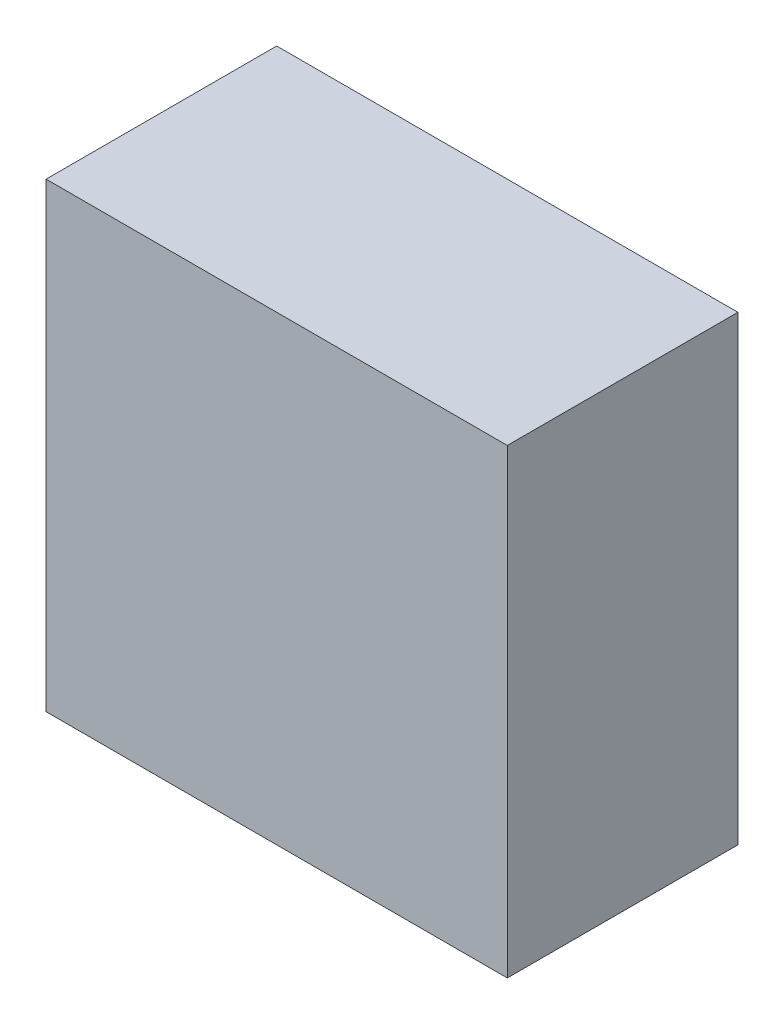
ISO-10303-21;
HEADER;
FILE_DESCRIPTION(('STEP AP214'),'2;1');
FILE_NAME('part.step','',(''),(''),'','','');
FILE_SCHEMA(('AUTOMOTIVE_DESIGN { 1 0 10303 214 1 1 1 1 }'));
ENDSEC;
DATA;
#1=APPLICATION_CONTEXT('core data for automotive mechanical design processes');
#2=APPLICATION_PROTOCOL_DEFINITION('international standard','automotive_design',2000,#1);
#3=PRODUCT_CONTEXT('',#1,'mechanical');
#4=PRODUCT('Part','Part','',(#3));
#5=PRODUCT_RELATED_PRODUCT_CATEGORY('part','',(#4));
#6=PRODUCT_DEFINITION_FORMATION('','',#4);
#7=PRODUCT_DEFINITION_CONTEXT('part definition',#1,'design');
#8=PRODUCT_DEFINITION('design','',#6,#7);
#9=PRODUCT_DEFINITION_SHAPE('','',#8);
#10=(LENGTH_UNIT() NAMED_UNIT(*) SI_UNIT(.MILLI.,.METRE.));
#11=(NAMED_UNIT(*) PLANE_ANGLE_UNIT() SI_UNIT($,.RADIAN.));
#12=(NAMED_UNIT(*) SI_UNIT($,.STERADIAN.) SOLID_ANGLE_UNIT());
#13=UNCERTAINTY_MEASURE_WITH_UNIT(LENGTH_MEASURE(1.E-05),#10,'distance_accuracy_value','');
#14=(GEOMETRIC_REPRESENTATION_CONTEXT(3) GLOBAL_UNCERTAINTY_ASSIGNED_CONTEXT((#13)) GLOBAL_UNIT_ASSIGNED_CONTEXT((#10,
#11,#12)) REPRESENTATION_CONTEXT('',''));
#15=CARTESIAN_POINT('',(0.,0.,0.));
#16=DIRECTION('',(0.,0.,1.));
#17=DIRECTION('',(1.,0.,0.));
#18=AXIS2_PLACEMENT_3D('',#15,#16,#17);
#19=CARTESIAN_POINT('',(10.,-10.,10.));
#20=DIRECTION('',(-1.,0.,0.));
#21=DIRECTION('',(0.,0.,1.));
#22=AXIS2_PLACEMENT_3D('',#19,#20,#21);
#23=PLANE('',#22);
#24=DIRECTION('',(0.,1.,0.));
#25=VECTOR('',#24,1.);
#26=CARTESIAN_POINT('',(10.,-10.,0.));
#27=LINE('',#26,#25);
#28=CARTESIAN_POINT('',(10.,-10.,0.));
#29=VERTEX_POINT('',#28);
#30=CARTESIAN_POINT('',(10.,10.,0.));
#31=VERTEX_POINT('',#30);
#32=EDGE_CURVE('E301',#29,#31,#27,.T.);
#33=ORIENTED_EDGE('',*,*,#32,.T.);
#34=DIRECTION('',(0.,0.,-1.));
#35=VECTOR('',#34,1.);
#36=CARTESIAN_POINT('',(10.,10.,10.));
#37=LINE('',#36,#35);
#38=CARTESIAN_POINT('',(10.,10.,10.));
#39=VERTEX_POINT('',#38);
#40=EDGE_CURVE('E42',#39,#31,#37,.T.);
#41=ORIENTED_EDGE('',*,*,#40,.F.);
#42=DIRECTION('',(0.,1.,0.));
#43=VECTOR('',#42,1.);
#44=CARTESIAN_POINT('',(10.,-10.,10.));
#45=LINE('',#44,#43);
#46=CARTESIAN_POINT('',(10.,-10.,10.));
#47=VERTEX_POINT('',#46);
#48=EDGE_CURVE('E307',#47,#39,#45,.T.);
#49=ORIENTED_EDGE('',*,*,#48,.F.);
#50=DIRECTION('',(0.,0.,-1.));
#51=VECTOR('',#50,1.);
#52=CARTESIAN_POINT('',(10.,-10.,10.));
#53=LINE('',#52,#51);
#54=EDGE_CURVE('E317',#47,#29,#53,.T.);
#55=ORIENTED_EDGE('',*,*,#54,.T.);
#56=EDGE_LOOP('',(#33,#41,#49,#55));
#57=FACE_BOUND('',#56,.T.);
#58=ADVANCED_FACE('F35',(#57),#23,.F.);
#59=CARTESIAN_POINT('',(-10.,10.,10.));
#60=DIRECTION('',(0.,-1.,0.));
#61=DIRECTION('',(0.,0.,-1.));
#62=AXIS2_PLACEMENT_3D('',#59,#60,#61);
#63=PLANE('',#62);
#64=DIRECTION('',(-1.,0.,0.));
#65=VECTOR('',#64,1.);
#66=CARTESIAN_POINT('',(-10.,10.,0.));
#67=LINE('',#66,#65);
#68=CARTESIAN_POINT('',(-10.,10.,0.));
#69=VERTEX_POINT('',#68);
#70=EDGE_CURVE('E320',#31,#69,#67,.T.);
#71=ORIENTED_EDGE('',*,*,#70,.T.);
#72=DIRECTION('',(0.,0.,-1.));
#73=VECTOR('',#72,1.);
#74=CARTESIAN_POINT('',(-10.,10.,10.));
#75=LINE('',#74,#73);
#76=CARTESIAN_POINT('',(-10.,10.,10.));
#77=VERTEX_POINT('',#76);
#78=EDGE_CURVE('E330',#77,#69,#75,.T.);
#79=ORIENTED_EDGE('',*,*,#78,.F.);
#80=DIRECTION('',(-1.,0.,0.));
#81=VECTOR('',#80,1.);
#82=CARTESIAN_POINT('',(-10.,10.,10.));
#83=LINE('',#82,#81);
#84=EDGE_CURVE('E310',#39,#77,#83,.T.);
#85=ORIENTED_EDGE('',*,*,#84,.F.);
#86=ORIENTED_EDGE('',*,*,#40,.T.);
#87=EDGE_LOOP('',(#71,#79,#85,#86));
#88=FACE_BOUND('',#87,.T.);
#89=ADVANCED_FACE('F335',(#88),#63,.F.);
#90=CARTESIAN_POINT('',(-10.,-10.,10.));
#91=DIRECTION('',(1.,0.,0.));
#92=DIRECTION('',(0.,0.,-1.));
#93=AXIS2_PLACEMENT_3D('',#90,#91,#92);
#94=PLANE('',#93);
#95=DIRECTION('',(0.,-1.,0.));
#96=VECTOR('',#95,1.);
#97=CARTESIAN_POINT('',(-10.,-10.,0.));
#98=LINE('',#97,#96);
#99=CARTESIAN_POINT('',(-10.,-10.,0.));
#100=VERTEX_POINT('',#99);
#101=EDGE_CURVE('E322',#69,#100,#98,.T.);
#102=ORIENTED_EDGE('',*,*,#101,.T.);
#103=DIRECTION('',(0.,0.,-1.));
#104=VECTOR('',#103,1.);
#105=CARTESIAN_POINT('',(-10.,-10.,10.));
#106=LINE('',#105,#104);
#107=CARTESIAN_POINT('',(-10.,-10.,10.));
#108=VERTEX_POINT('',#107);
#109=EDGE_CURVE('E327',#108,#100,#106,.T.);
#110=ORIENTED_EDGE('',*,*,#109,.F.);
#111=DIRECTION('',(0.,-1.,0.));
#112=VECTOR('',#111,1.);
#113=CARTESIAN_POINT('',(-10.,-10.,10.));
#114=LINE('',#113,#112);
#115=EDGE_CURVE('E313',#77,#108,#114,.T.);
#116=ORIENTED_EDGE('',*,*,#115,.F.);
#117=ORIENTED_EDGE('',*,*,#78,.T.);
#118=EDGE_LOOP('',(#102,#110,#116,#117));
#119=FACE_BOUND('',#118,.T.);
#120=ADVANCED_FACE('F347',(#119),#94,.F.);
#121=CARTESIAN_POINT('',(-10.,-10.,10.));
#122=DIRECTION('',(0.,1.,0.));
#123=DIRECTION('',(0.,0.,1.));
#124=AXIS2_PLACEMENT_3D('',#121,#122,#123);
#125=PLANE('',#124);
#126=DIRECTION('',(1.,0.,0.));
#127=VECTOR('',#126,1.);
#128=CARTESIAN_POINT('',(-10.,-10.,0.));
#129=LINE('',#128,#127);
#130=EDGE_CURVE('E311',#100,#29,#129,.T.);
#131=ORIENTED_EDGE('',*,*,#130,.T.);
#132=ORIENTED_EDGE('',*,*,#54,.F.);
#133=DIRECTION('',(1.,0.,0.));
#134=VECTOR('',#133,1.);
#135=CARTESIAN_POINT('',(-10.,-10.,10.));
#136=LINE('',#135,#134);
#137=EDGE_CURVE('E315',#108,#47,#136,.T.);
#138=ORIENTED_EDGE('',*,*,#137,.F.);
#139=ORIENTED_EDGE('',*,*,#109,.T.);
#140=EDGE_LOOP('',(#131,#132,#138,#139));
#141=FACE_BOUND('',#140,.T.);
#142=ADVANCED_FACE('F351',(#141),#125,.F.);
#143=CARTESIAN_POINT('',(0.,0.,10.));
#144=DIRECTION('',(0.,0.,-1.));
#145=DIRECTION('',(-1.,0.,0.));
#146=AXIS2_PLACEMENT_3D('',#143,#144,#145);
#147=PLANE('',#146);
#148=ORIENTED_EDGE('',*,*,#48,.T.);
#149=ORIENTED_EDGE('',*,*,#84,.T.);
#150=ORIENTED_EDGE('',*,*,#115,.T.);
#151=ORIENTED_EDGE('',*,*,#137,.T.);
#152=EDGE_LOOP('',(#148,#149,#150,#151));
#153=FACE_BOUND('',#152,.T.);
#154=ADVANCED_FACE('F353',(#153),#147,.F.);
#155=CARTESIAN_POINT('',(0.,0.,0.));
#156=DIRECTION('',(0.,0.,-1.));
#157=DIRECTION('',(-1.,0.,0.));
#158=AXIS2_PLACEMENT_3D('',#155,#156,#157);
#159=PLANE('',#158);
#160=DIRECTION('',(0.,1.,0.));
#161=VECTOR('',#160,1.);
#162=CARTESIAN_POINT('',(-8.5,-8.5,0.));
#163=LINE('',#162,#161);
#164=CARTESIAN_POINT('',(-8.5,-8.5,0.));
#165=VERTEX_POINT('',#164);
#166=CARTESIAN_POINT('',(-8.5,8.5,0.));
#167=VERTEX_POINT('',#166);
#168=EDGE_CURVE('E57',#165,#167,#163,.T.);
#169=ORIENTED_EDGE('',*,*,#168,.F.);
#170=DIRECTION('',(-1.,0.,0.));
#171=VECTOR('',#170,1.);
#172=CARTESIAN_POINT('',(8.5,-8.5,0.));
#173=LINE('',#172,#171);
#174=CARTESIAN_POINT('',(8.5,-8.5,0.));
#175=VERTEX_POINT('',#174);
#176=EDGE_CURVE('E280',#175,#165,#173,.T.);
#177=ORIENTED_EDGE('',*,*,#176,.F.);
#178=DIRECTION('',(0.,-1.,0.));
#179=VECTOR('',#178,1.);
#180=CARTESIAN_POINT('',(8.5,-8.5,0.));
#181=LINE('',#180,#179);
#182=CARTESIAN_POINT('',(8.5,8.5,0.));
#183=VERTEX_POINT('',#182);
#184=EDGE_CURVE('E294',#183,#175,#181,.T.);
#185=ORIENTED_EDGE('',*,*,#184,.F.);
#186=DIRECTION('',(1.,0.,0.));
#187=VECTOR('',#186,1.);
#188=CARTESIAN_POINT('',(8.5,8.5,0.));
#189=LINE('',#188,#187);
#190=EDGE_CURVE('E291',#167,#183,#189,.T.);
#191=ORIENTED_EDGE('',*,*,#190,.F.);
#192=EDGE_LOOP('',(#169,#177,#185,#191));
#193=FACE_BOUND('',#192,.T.);
#194=ORIENTED_EDGE('',*,*,#32,.F.);
#195=ORIENTED_EDGE('',*,*,#130,.F.);
#196=ORIENTED_EDGE('',*,*,#101,.F.);
#197=ORIENTED_EDGE('',*,*,#70,.F.);
#198=EDGE_LOOP('',(#194,#195,#196,#197));
#199=FACE_BOUND('',#198,.T.);
#200=ADVANCED_FACE('F343',(#193,#199),#159,.T.);
#201=CARTESIAN_POINT('',(-8.5,-8.5,7.5));
#202=DIRECTION('',(-1.,0.,0.));
#203=DIRECTION('',(0.,0.,1.));
#204=AXIS2_PLACEMENT_3D('',#201,#202,#203);
#205=PLANE('',#204);
#206=ORIENTED_EDGE('',*,*,#168,.T.);
#207=DIRECTION('',(0.,0.,-1.));
#208=VECTOR('',#207,1.);
#209=CARTESIAN_POINT('',(-8.5,8.5,7.5));
#210=LINE('',#209,#208);
#211=CARTESIAN_POINT('',(-8.5,8.5,7.5));
#212=VERTEX_POINT('',#211);
#213=EDGE_CURVE('E289',#212,#167,#210,.T.);
#214=ORIENTED_EDGE('',*,*,#213,.F.);
#215=DIRECTION('',(0.,1.,0.));
#216=VECTOR('',#215,1.);
#217=CARTESIAN_POINT('',(-8.5,-8.5,7.5));
#218=LINE('',#217,#216);
#219=CARTESIAN_POINT('',(-8.5,-8.5,7.5));
#220=VERTEX_POINT('',#219);
#221=EDGE_CURVE('E276',#220,#212,#218,.T.);
#222=ORIENTED_EDGE('',*,*,#221,.F.);
#223=DIRECTION('',(0.,0.,-1.));
#224=VECTOR('',#223,1.);
#225=CARTESIAN_POINT('',(-8.5,-8.5,7.5));
#226=LINE('',#225,#224);
#227=EDGE_CURVE('E299',#220,#165,#226,.T.);
#228=ORIENTED_EDGE('',*,*,#227,.T.);
#229=EDGE_LOOP('',(#206,#214,#222,#228));
#230=FACE_BOUND('',#229,.T.);
#231=ADVANCED_FACE('F360',(#230),#205,.F.);
#232=CARTESIAN_POINT('',(8.5,-8.5,7.5));
#233=DIRECTION('',(0.,-1.,0.));
#234=DIRECTION('',(0.,0.,-1.));
#235=AXIS2_PLACEMENT_3D('',#232,#233,#234);
#236=PLANE('',#235);
#237=ORIENTED_EDGE('',*,*,#176,.T.);
#238=ORIENTED_EDGE('',*,*,#227,.F.);
#239=DIRECTION('',(-1.,0.,0.));
#240=VECTOR('',#239,1.);
#241=CARTESIAN_POINT('',(8.5,-8.5,7.5));
#242=LINE('',#241,#240);
#243=CARTESIAN_POINT('',(8.5,-8.5,7.5));
#244=VERTEX_POINT('',#243);
#245=EDGE_CURVE('E286',#244,#220,#242,.T.);
#246=ORIENTED_EDGE('',*,*,#245,.F.);
#247=DIRECTION('',(0.,0.,-1.));
#248=VECTOR('',#247,1.);
#249=CARTESIAN_POINT('',(8.5,-8.5,7.5));
#250=LINE('',#249,#248);
#251=EDGE_CURVE('E302',#244,#175,#250,.T.);
#252=ORIENTED_EDGE('',*,*,#251,.T.);
#253=EDGE_LOOP('',(#237,#238,#246,#252));
#254=FACE_BOUND('',#253,.T.);
#255=ADVANCED_FACE('F398',(#254),#236,.F.);
#256=CARTESIAN_POINT('',(8.5,-8.5,7.5));
#257=DIRECTION('',(1.,0.,0.));
#258=DIRECTION('',(0.,0.,-1.));
#259=AXIS2_PLACEMENT_3D('',#256,#257,#258);
#260=PLANE('',#259);
#261=ORIENTED_EDGE('',*,*,#184,.T.);
#262=ORIENTED_EDGE('',*,*,#251,.F.);
#263=DIRECTION('',(0.,-1.,0.));
#264=VECTOR('',#263,1.);
#265=CARTESIAN_POINT('',(8.5,-8.5,7.5));
#266=LINE('',#265,#264);
#267=CARTESIAN_POINT('',(8.5,8.5,7.5));
#268=VERTEX_POINT('',#267);
#269=EDGE_CURVE('E283',#268,#244,#266,.T.);
#270=ORIENTED_EDGE('',*,*,#269,.F.);
#271=DIRECTION('',(0.,0.,-1.));
#272=VECTOR('',#271,1.);
#273=CARTESIAN_POINT('',(8.5,8.5,7.5));
#274=LINE('',#273,#272);
#275=EDGE_CURVE('E304',#268,#183,#274,.T.);
#276=ORIENTED_EDGE('',*,*,#275,.T.);
#277=EDGE_LOOP('',(#261,#262,#270,#276));
#278=FACE_BOUND('',#277,.T.);
#279=ADVANCED_FACE('F406',(#278),#260,.F.);
#280=CARTESIAN_POINT('',(8.5,8.5,7.5));
#281=DIRECTION('',(0.,1.,0.));
#282=DIRECTION('',(0.,0.,1.));
#283=AXIS2_PLACEMENT_3D('',#280,#281,#282);
#284=PLANE('',#283);
#285=ORIENTED_EDGE('',*,*,#190,.T.);
#286=ORIENTED_EDGE('',*,*,#275,.F.);
#287=DIRECTION('',(1.,0.,0.));
#288=VECTOR('',#287,1.);
#289=CARTESIAN_POINT('',(8.5,8.5,7.5));
#290=LINE('',#289,#288);
#291=EDGE_CURVE('E279',#212,#268,#290,.T.);
#292=ORIENTED_EDGE('',*,*,#291,.F.);
#293=ORIENTED_EDGE('',*,*,#213,.T.);
#294=EDGE_LOOP('',(#285,#286,#292,#293));
#295=FACE_BOUND('',#294,.T.);
#296=ADVANCED_FACE('F416',(#295),#284,.F.);
#297=CARTESIAN_POINT('',(0.,0.,7.5));
#298=DIRECTION('',(0.,0.,1.));
#299=DIRECTION('',(1.,0.,0.));
#300=AXIS2_PLACEMENT_3D('',#297,#298,#299);
#301=PLANE('',#300);
#302=CARTESIAN_POINT('',(0.,0.,7.5));
#303=DIRECTION('',(0.,0.,1.));
#304=DIRECTION('',(1.,0.,0.));
#305=AXIS2_PLACEMENT_3D('',#302,#303,#304);
#306=CIRCLE('',#305,2.65);
#307=CARTESIAN_POINT('',(2.65,0.,7.5));
#308=VERTEX_POINT('',#307);
#309=EDGE_CURVE('E11',#308,#308,#306,.F.);
#310=ORIENTED_EDGE('',*,*,#309,.F.);
#311=EDGE_LOOP('',(#310));
#312=FACE_BOUND('',#311,.T.);
#313=ORIENTED_EDGE('',*,*,#221,.T.);
#314=ORIENTED_EDGE('',*,*,#291,.T.);
#315=ORIENTED_EDGE('',*,*,#269,.T.);
#316=ORIENTED_EDGE('',*,*,#245,.T.);
#317=EDGE_LOOP('',(#313,#314,#315,#316));
#318=FACE_BOUND('',#317,.T.);
#319=ADVANCED_FACE('F426',(#312,#318),#301,.F.);
#320=CARTESIAN_POINT('',(0.,0.,0.));
#321=DIRECTION('',(0.,0.,1.));
#322=DIRECTION('',(1.,0.,0.));
#323=AXIS2_PLACEMENT_3D('',#320,#321,#322);
#324=CYLINDRICAL_SURFACE('',#323,2.65);
#325=CARTESIAN_POINT('',(0.,0.,0.));
#326=DIRECTION('',(0.,0.,-1.));
#327=DIRECTION('',(-1.,0.,0.));
#328=AXIS2_PLACEMENT_3D('',#325,#326,#327);
#329=CIRCLE('',#328,2.65);
#330=CARTESIAN_POINT('',(-2.65,0.,0.));
#331=VERTEX_POINT('',#330);
#332=EDGE_CURVE('E254',#331,#331,#329,.T.);
#333=ORIENTED_EDGE('',*,*,#332,.F.);
#334=EDGE_LOOP('',(#333));
#335=FACE_BOUND('',#334,.T.);
#336=ORIENTED_EDGE('',*,*,#309,.T.);
#337=EDGE_LOOP('',(#336));
#338=FACE_BOUND('',#337,.T.);
#339=ADVANCED_FACE('F436',(#335,#338),#324,.T.);
#340=CARTESIAN_POINT('',(0.,0.,0.));
#341=DIRECTION('',(0.,0.,-1.));
#342=DIRECTION('',(-1.,0.,0.));
#343=AXIS2_PLACEMENT_3D('',#340,#341,#342);
#344=PLANE('',#343);
#345=DIRECTION('',(-1.,0.,0.));
#346=VECTOR('',#345,1.);
#347=CARTESIAN_POINT('',(-0.7,-0.7,0.));
#348=LINE('',#347,#346);
#349=CARTESIAN_POINT('',(-0.7,-0.7,0.));
#350=VERTEX_POINT('',#349);
#351=CARTESIAN_POINT('',(-2.15,-0.7,0.));
#352=VERTEX_POINT('',#351);
#353=EDGE_CURVE('E49',#350,#352,#348,.T.);
#354=ORIENTED_EDGE('',*,*,#353,.F.);
#355=DIRECTION('',(0.,1.,0.));
#356=VECTOR('',#355,1.);
#357=CARTESIAN_POINT('',(-0.7,-2.15,0.));
#358=LINE('',#357,#356);
#359=CARTESIAN_POINT('',(-0.7,-2.15,0.));
#360=VERTEX_POINT('',#359);
#361=EDGE_CURVE('E192',#360,#350,#358,.T.);
#362=ORIENTED_EDGE('',*,*,#361,.F.);
#363=DIRECTION('',(-1.,0.,0.));
#364=VECTOR('',#363,1.);
#365=CARTESIAN_POINT('',(0.7,-2.15,0.));
#366=LINE('',#365,#364);
#367=CARTESIAN_POINT('',(0.7,-2.15,0.));
#368=VERTEX_POINT('',#367);
#369=EDGE_CURVE('E195',#368,#360,#366,.T.);
#370=ORIENTED_EDGE('',*,*,#369,.F.);
#371=DIRECTION('',(0.,-1.,0.));
#372=VECTOR('',#371,1.);
#373=CARTESIAN_POINT('',(0.7,-2.15,0.));
#374=LINE('',#373,#372);
#375=CARTESIAN_POINT('',(0.7,-0.7,0.));
#376=VERTEX_POINT('',#375);
#377=EDGE_CURVE('E247',#376,#368,#374,.T.);
#378=ORIENTED_EDGE('',*,*,#377,.F.);
#379=DIRECTION('',(-1.,0.,0.));
#380=VECTOR('',#379,1.);
#381=CARTESIAN_POINT('',(0.7,-0.7,0.));
#382=LINE('',#381,#380);
#383=CARTESIAN_POINT('',(2.15,-0.7,0.));
#384=VERTEX_POINT('',#383);
#385=EDGE_CURVE('E244',#384,#376,#382,.T.);
#386=ORIENTED_EDGE('',*,*,#385,.F.);
#387=DIRECTION('',(0.,-1.,0.));
#388=VECTOR('',#387,1.);
#389=CARTESIAN_POINT('',(2.15,0.7,0.));
#390=LINE('',#389,#388);
#391=CARTESIAN_POINT('',(2.15,0.7,0.));
#392=VERTEX_POINT('',#391);
#393=EDGE_CURVE('E241',#392,#384,#390,.T.);
#394=ORIENTED_EDGE('',*,*,#393,.F.);
#395=DIRECTION('',(1.,0.,0.));
#396=VECTOR('',#395,1.);
#397=CARTESIAN_POINT('',(0.7,0.7,0.));
#398=LINE('',#397,#396);
#399=CARTESIAN_POINT('',(0.7,0.7,0.));
#400=VERTEX_POINT('',#399);
#401=EDGE_CURVE('E238',#400,#392,#398,.T.);
#402=ORIENTED_EDGE('',*,*,#401,.F.);
#403=DIRECTION('',(0.,-1.,0.));
#404=VECTOR('',#403,1.);
#405=CARTESIAN_POINT('',(0.7,2.15,0.));
#406=LINE('',#405,#404);
#407=CARTESIAN_POINT('',(0.7,2.15,0.));
#408=VERTEX_POINT('',#407);
#409=EDGE_CURVE('E235',#408,#400,#406,.T.);
#410=ORIENTED_EDGE('',*,*,#409,.F.);
#411=DIRECTION('',(1.,0.,0.));
#412=VECTOR('',#411,1.);
#413=CARTESIAN_POINT('',(0.7,2.15,0.));
#414=LINE('',#413,#412);
#415=CARTESIAN_POINT('',(-0.7,2.15,0.));
#416=VERTEX_POINT('',#415);
#417=EDGE_CURVE('E232',#416,#408,#414,.T.);
#418=ORIENTED_EDGE('',*,*,#417,.F.);
#419=DIRECTION('',(0.,1.,0.));
#420=VECTOR('',#419,1.);
#421=CARTESIAN_POINT('',(-0.7,2.15,0.));
#422=LINE('',#421,#420);
#423=CARTESIAN_POINT('',(-0.7,0.7,0.));
#424=VERTEX_POINT('',#423);
#425=EDGE_CURVE('E229',#424,#416,#422,.T.);
#426=ORIENTED_EDGE('',*,*,#425,.F.);
#427=DIRECTION('',(1.,0.,0.));
#428=VECTOR('',#427,1.);
#429=CARTESIAN_POINT('',(-0.7,0.7,0.));
#430=LINE('',#429,#428);
#431=CARTESIAN_POINT('',(-2.15,0.7,0.));
#432=VERTEX_POINT('',#431);
#433=EDGE_CURVE('E226',#432,#424,#430,.T.);
#434=ORIENTED_EDGE('',*,*,#433,.F.);
#435=DIRECTION('',(0.,1.,0.));
#436=VECTOR('',#435,1.);
#437=CARTESIAN_POINT('',(-2.15,0.7,0.));
#438=LINE('',#437,#436);
#439=EDGE_CURVE('E224',#352,#432,#438,.T.);
#440=ORIENTED_EDGE('',*,*,#439,.F.);
#441=EDGE_LOOP('',(#354,#362,#370,#378,#386,#394,#402,#410,#418,#426,#434,#440));
#442=FACE_BOUND('',#441,.T.);
#443=ORIENTED_EDGE('',*,*,#332,.T.);
#444=EDGE_LOOP('',(#443));
#445=FACE_BOUND('',#444,.T.);
#446=ADVANCED_FACE('F446',(#442,#445),#344,.T.);
#447=CARTESIAN_POINT('',(-0.7,-0.7,7.5));
#448=DIRECTION('',(0.,-1.,0.));
#449=DIRECTION('',(0.,0.,-1.));
#450=AXIS2_PLACEMENT_3D('',#447,#448,#449);
#451=PLANE('',#450);
#452=ORIENTED_EDGE('',*,*,#353,.T.);
#453=DIRECTION('',(0.,0.,-1.));
#454=VECTOR('',#453,1.);
#455=CARTESIAN_POINT('',(-2.15,-0.7,7.5));
#456=LINE('',#455,#454);
#457=CARTESIAN_POINT('',(-2.15,-0.7,7.5));
#458=VERTEX_POINT('',#457);
#459=EDGE_CURVE('E169',#458,#352,#456,.T.);
#460=ORIENTED_EDGE('',*,*,#459,.F.);
#461=DIRECTION('',(-1.,0.,0.));
#462=VECTOR('',#461,1.);
#463=CARTESIAN_POINT('',(-0.7,-0.7,7.5));
#464=LINE('',#463,#462);
#465=CARTESIAN_POINT('',(-0.7,-0.7,7.5));
#466=VERTEX_POINT('',#465);
#467=EDGE_CURVE('E173',#466,#458,#464,.T.);
#468=ORIENTED_EDGE('',*,*,#467,.F.);
#469=DIRECTION('',(0.,0.,-1.));
#470=VECTOR('',#469,1.);
#471=CARTESIAN_POINT('',(-0.7,-0.7,7.5));
#472=LINE('',#471,#470);
#473=EDGE_CURVE('E252',#466,#350,#472,.T.);
#474=ORIENTED_EDGE('',*,*,#473,.T.);
#475=EDGE_LOOP('',(#452,#460,#468,#474));
#476=FACE_BOUND('',#475,.T.);
#477=ADVANCED_FACE('F171',(#476),#451,.F.);
#478=CARTESIAN_POINT('',(-0.7,-2.15,7.5));
#479=DIRECTION('',(-1.,0.,0.));
#480=DIRECTION('',(0.,-1.,0.));
#481=AXIS2_PLACEMENT_3D('',#478,#479,#480);
#482=PLANE('',#481);
#483=ORIENTED_EDGE('',*,*,#361,.T.);
#484=ORIENTED_EDGE('',*,*,#473,.F.);
#485=DIRECTION('',(0.,1.,0.));
#486=VECTOR('',#485,1.);
#487=CARTESIAN_POINT('',(-0.7,-2.15,7.5));
#488=LINE('',#487,#486);
#489=CARTESIAN_POINT('',(-0.7,-2.15,7.5));
#490=VERTEX_POINT('',#489);
#491=EDGE_CURVE('E179',#490,#466,#488,.T.);
#492=ORIENTED_EDGE('',*,*,#491,.F.);
#493=DIRECTION('',(0.,0.,-1.));
#494=VECTOR('',#493,1.);
#495=CARTESIAN_POINT('',(-0.7,-2.15,7.5));
#496=LINE('',#495,#494);
#497=EDGE_CURVE('E255',#490,#360,#496,.T.);
#498=ORIENTED_EDGE('',*,*,#497,.T.);
#499=EDGE_LOOP('',(#483,#484,#492,#498));
#500=FACE_BOUND('',#499,.T.);
#501=ADVANCED_FACE('F465',(#500),#482,.F.);
#502=CARTESIAN_POINT('',(0.7,-2.15,7.5));
#503=DIRECTION('',(0.,-1.,0.));
#504=DIRECTION('',(0.,0.,-1.));
#505=AXIS2_PLACEMENT_3D('',#502,#503,#504);
#506=PLANE('',#505);
#507=ORIENTED_EDGE('',*,*,#369,.T.);
#508=ORIENTED_EDGE('',*,*,#497,.F.);
#509=DIRECTION('',(-1.,0.,0.));
#510=VECTOR('',#509,1.);
#511=CARTESIAN_POINT('',(0.7,-2.15,7.5));
#512=LINE('',#511,#510);
#513=CARTESIAN_POINT('',(0.7,-2.15,7.5));
#514=VERTEX_POINT('',#513);
#515=EDGE_CURVE('E220',#514,#490,#512,.T.);
#516=ORIENTED_EDGE('',*,*,#515,.F.);
#517=DIRECTION('',(0.,0.,-1.));
#518=VECTOR('',#517,1.);
#519=CARTESIAN_POINT('',(0.7,-2.15,7.5));
#520=LINE('',#519,#518);
#521=EDGE_CURVE('E257',#514,#368,#520,.T.);
#522=ORIENTED_EDGE('',*,*,#521,.T.);
#523=EDGE_LOOP('',(#507,#508,#516,#522));
#524=FACE_BOUND('',#523,.T.);
#525=ADVANCED_FACE('F474',(#524),#506,.F.);
#526=CARTESIAN_POINT('',(0.7,-2.15,7.5));
#527=DIRECTION('',(1.,0.,0.));
#528=DIRECTION('',(0.,1.,0.));
#529=AXIS2_PLACEMENT_3D('',#526,#527,#528);
#530=PLANE('',#529);
#531=ORIENTED_EDGE('',*,*,#377,.T.);
#532=ORIENTED_EDGE('',*,*,#521,.F.);
#533=DIRECTION('',(0.,-1.,0.));
#534=VECTOR('',#533,1.);
#535=CARTESIAN_POINT('',(0.7,-2.15,7.5));
#536=LINE('',#535,#534);
#537=CARTESIAN_POINT('',(0.7,-0.7,7.5));
#538=VERTEX_POINT('',#537);
#539=EDGE_CURVE('E217',#538,#514,#536,.T.);
#540=ORIENTED_EDGE('',*,*,#539,.F.);
#541=DIRECTION('',(0.,0.,-1.));
#542=VECTOR('',#541,1.);
#543=CARTESIAN_POINT('',(0.7,-0.7,7.5));
#544=LINE('',#543,#542);
#545=EDGE_CURVE('E259',#538,#376,#544,.T.);
#546=ORIENTED_EDGE('',*,*,#545,.T.);
#547=EDGE_LOOP('',(#531,#532,#540,#546));
#548=FACE_BOUND('',#547,.T.);
#549=ADVANCED_FACE('F484',(#548),#530,.F.);
#550=CARTESIAN_POINT('',(0.7,-0.7,7.5));
#551=DIRECTION('',(0.,-1.,0.));
#552=DIRECTION('',(0.,0.,-1.));
#553=AXIS2_PLACEMENT_3D('',#550,#551,#552);
#554=PLANE('',#553);
#555=ORIENTED_EDGE('',*,*,#385,.T.);
#556=ORIENTED_EDGE('',*,*,#545,.F.);
#557=DIRECTION('',(-1.,0.,0.));
#558=VECTOR('',#557,1.);
#559=CARTESIAN_POINT('',(0.7,-0.7,7.5));
#560=LINE('',#559,#558);
#561=CARTESIAN_POINT('',(2.15,-0.7,7.5));
#562=VERTEX_POINT('',#561);
#563=EDGE_CURVE('E214',#562,#538,#560,.T.);
#564=ORIENTED_EDGE('',*,*,#563,.F.);
#565=DIRECTION('',(0.,0.,-1.));
#566=VECTOR('',#565,1.);
#567=CARTESIAN_POINT('',(2.15,-0.7,7.5));
#568=LINE('',#567,#566);
#569=EDGE_CURVE('E261',#562,#384,#568,.T.);
#570=ORIENTED_EDGE('',*,*,#569,.T.);
#571=EDGE_LOOP('',(#555,#556,#564,#570));
#572=FACE_BOUND('',#571,.T.);
#573=ADVANCED_FACE('F494',(#572),#554,.F.);
#574=CARTESIAN_POINT('',(2.15,0.7,7.5));
#575=DIRECTION('',(1.,0.,0.));
#576=DIRECTION('',(0.,0.,-1.));
#577=AXIS2_PLACEMENT_3D('',#574,#575,#576);
#578=PLANE('',#577);
#579=ORIENTED_EDGE('',*,*,#393,.T.);
#580=ORIENTED_EDGE('',*,*,#569,.F.);
#581=DIRECTION('',(0.,-1.,0.));
#582=VECTOR('',#581,1.);
#583=CARTESIAN_POINT('',(2.15,0.7,7.5));
#584=LINE('',#583,#582);
#585=CARTESIAN_POINT('',(2.15,0.7,7.5));
#586=VERTEX_POINT('',#585);
#587=EDGE_CURVE('E211',#586,#562,#584,.T.);
#588=ORIENTED_EDGE('',*,*,#587,.F.);
#589=DIRECTION('',(0.,0.,-1.));
#590=VECTOR('',#589,1.);
#591=CARTESIAN_POINT('',(2.15,0.7,7.5));
#592=LINE('',#591,#590);
#593=EDGE_CURVE('E263',#586,#392,#592,.T.);
#594=ORIENTED_EDGE('',*,*,#593,.T.);
#595=EDGE_LOOP('',(#579,#580,#588,#594));
#596=FACE_BOUND('',#595,.T.);
#597=ADVANCED_FACE('F504',(#596),#578,.F.);
#598=CARTESIAN_POINT('',(0.7,0.7,7.5));
#599=DIRECTION('',(0.,1.,0.));
#600=DIRECTION('',(0.,0.,1.));
#601=AXIS2_PLACEMENT_3D('',#598,#599,#600);
#602=PLANE('',#601);
#603=ORIENTED_EDGE('',*,*,#401,.T.);
#604=ORIENTED_EDGE('',*,*,#593,.F.);
#605=DIRECTION('',(1.,0.,0.));
#606=VECTOR('',#605,1.);
#607=CARTESIAN_POINT('',(0.7,0.7,7.5));
#608=LINE('',#607,#606);
#609=CARTESIAN_POINT('',(0.7,0.7,7.5));
#610=VERTEX_POINT('',#609);
#611=EDGE_CURVE('E208',#610,#586,#608,.T.);
#612=ORIENTED_EDGE('',*,*,#611,.F.);
#613=DIRECTION('',(0.,0.,-1.));
#614=VECTOR('',#613,1.);
#615=CARTESIAN_POINT('',(0.7,0.7,7.5));
#616=LINE('',#615,#614);
#617=EDGE_CURVE('E265',#610,#400,#616,.T.);
#618=ORIENTED_EDGE('',*,*,#617,.T.);
#619=EDGE_LOOP('',(#603,#604,#612,#618));
#620=FACE_BOUND('',#619,.T.);
#621=ADVANCED_FACE('F514',(#620),#602,.F.);
#622=CARTESIAN_POINT('',(0.7,2.15,7.5));
#623=DIRECTION('',(1.,0.,0.));
#624=DIRECTION('',(0.,1.,0.));
#625=AXIS2_PLACEMENT_3D('',#622,#623,#624);
#626=PLANE('',#625);
#627=ORIENTED_EDGE('',*,*,#409,.T.);
#628=ORIENTED_EDGE('',*,*,#617,.F.);
#629=DIRECTION('',(0.,-1.,0.));
#630=VECTOR('',#629,1.);
#631=CARTESIAN_POINT('',(0.7,2.15,7.5));
#632=LINE('',#631,#630);
#633=CARTESIAN_POINT('',(0.7,2.15,7.5));
#634=VERTEX_POINT('',#633);
#635=EDGE_CURVE('E205',#634,#610,#632,.T.);
#636=ORIENTED_EDGE('',*,*,#635,.F.);
#637=DIRECTION('',(0.,0.,-1.));
#638=VECTOR('',#637,1.);
#639=CARTESIAN_POINT('',(0.7,2.15,7.5));
#640=LINE('',#639,#638);
#641=EDGE_CURVE('E267',#634,#408,#640,.T.);
#642=ORIENTED_EDGE('',*,*,#641,.T.);
#643=EDGE_LOOP('',(#627,#628,#636,#642));
#644=FACE_BOUND('',#643,.T.);
#645=ADVANCED_FACE('F524',(#644),#626,.F.);
#646=CARTESIAN_POINT('',(0.7,2.15,7.5));
#647=DIRECTION('',(0.,1.,0.));
#648=DIRECTION('',(0.,0.,1.));
#649=AXIS2_PLACEMENT_3D('',#646,#647,#648);
#650=PLANE('',#649);
#651=ORIENTED_EDGE('',*,*,#417,.T.);
#652=ORIENTED_EDGE('',*,*,#641,.F.);
#653=DIRECTION('',(1.,0.,0.));
#654=VECTOR('',#653,1.);
#655=CARTESIAN_POINT('',(0.7,2.15,7.5));
#656=LINE('',#655,#654);
#657=CARTESIAN_POINT('',(-0.7,2.15,7.5));
#658=VERTEX_POINT('',#657);
#659=EDGE_CURVE('E202',#658,#634,#656,.T.);
#660=ORIENTED_EDGE('',*,*,#659,.F.);
#661=DIRECTION('',(0.,0.,-1.));
#662=VECTOR('',#661,1.);
#663=CARTESIAN_POINT('',(-0.7,2.15,7.5));
#664=LINE('',#663,#662);
#665=EDGE_CURVE('E269',#658,#416,#664,.T.);
#666=ORIENTED_EDGE('',*,*,#665,.T.);
#667=EDGE_LOOP('',(#651,#652,#660,#666));
#668=FACE_BOUND('',#667,.T.);
#669=ADVANCED_FACE('F534',(#668),#650,.F.);
#670=CARTESIAN_POINT('',(-0.7,2.15,7.5));
#671=DIRECTION('',(-1.,0.,0.));
#672=DIRECTION('',(0.,-1.,0.));
#673=AXIS2_PLACEMENT_3D('',#670,#671,#672);
#674=PLANE('',#673);
#675=ORIENTED_EDGE('',*,*,#425,.T.);
#676=ORIENTED_EDGE('',*,*,#665,.F.);
#677=DIRECTION('',(0.,1.,0.));
#678=VECTOR('',#677,1.);
#679=CARTESIAN_POINT('',(-0.7,2.15,7.5));
#680=LINE('',#679,#678);
#681=CARTESIAN_POINT('',(-0.7,0.7,7.5));
#682=VERTEX_POINT('',#681);
#683=EDGE_CURVE('E199',#682,#658,#680,.T.);
#684=ORIENTED_EDGE('',*,*,#683,.F.);
#685=DIRECTION('',(0.,0.,-1.));
#686=VECTOR('',#685,1.);
#687=CARTESIAN_POINT('',(-0.7,0.7,7.5));
#688=LINE('',#687,#686);
#689=EDGE_CURVE('E271',#682,#424,#688,.T.);
#690=ORIENTED_EDGE('',*,*,#689,.T.);
#691=EDGE_LOOP('',(#675,#676,#684,#690));
#692=FACE_BOUND('',#691,.T.);
#693=ADVANCED_FACE('F544',(#692),#674,.F.);
#694=CARTESIAN_POINT('',(-0.7,0.7,7.5));
#695=DIRECTION('',(0.,1.,0.));
#696=DIRECTION('',(0.,0.,1.));
#697=AXIS2_PLACEMENT_3D('',#694,#695,#696);
#698=PLANE('',#697);
#699=ORIENTED_EDGE('',*,*,#433,.T.);
#700=ORIENTED_EDGE('',*,*,#689,.F.);
#701=DIRECTION('',(1.,0.,0.));
#702=VECTOR('',#701,1.);
#703=CARTESIAN_POINT('',(-0.7,0.7,7.5));
#704=LINE('',#703,#702);
#705=CARTESIAN_POINT('',(-2.15,0.7,7.5));
#706=VERTEX_POINT('',#705);
#707=EDGE_CURVE('E187',#706,#682,#704,.T.);
#708=ORIENTED_EDGE('',*,*,#707,.F.);
#709=DIRECTION('',(0.,0.,-1.));
#710=VECTOR('',#709,1.);
#711=CARTESIAN_POINT('',(-2.15,0.7,7.5));
#712=LINE('',#711,#710);
#713=EDGE_CURVE('E178',#706,#432,#712,.T.);
#714=ORIENTED_EDGE('',*,*,#713,.T.);
#715=EDGE_LOOP('',(#699,#700,#708,#714));
#716=FACE_BOUND('',#715,.T.);
#717=ADVANCED_FACE('F554',(#716),#698,.F.);
#718=CARTESIAN_POINT('',(-2.15,0.7,7.5));
#719=DIRECTION('',(-1.,0.,0.));
#720=DIRECTION('',(0.,0.,1.));
#721=AXIS2_PLACEMENT_3D('',#718,#719,#720);
#722=PLANE('',#721);
#723=ORIENTED_EDGE('',*,*,#439,.T.);
#724=ORIENTED_EDGE('',*,*,#713,.F.);
#725=DIRECTION('',(0.,1.,0.));
#726=VECTOR('',#725,1.);
#727=CARTESIAN_POINT('',(-2.15,0.7,7.5));
#728=LINE('',#727,#726);
#729=EDGE_CURVE('E182',#458,#706,#728,.T.);
#730=ORIENTED_EDGE('',*,*,#729,.F.);
#731=ORIENTED_EDGE('',*,*,#459,.T.);
#732=EDGE_LOOP('',(#723,#724,#730,#731));
#733=FACE_BOUND('',#732,.T.);
#734=ADVANCED_FACE('F183',(#733),#722,.F.);
#735=CARTESIAN_POINT('',(0.,0.,7.5));
#736=DIRECTION('',(0.,0.,1.));
#737=DIRECTION('',(1.,0.,0.));
#738=AXIS2_PLACEMENT_3D('',#735,#736,#737);
#739=PLANE('',#738);
#740=ORIENTED_EDGE('',*,*,#467,.T.);
#741=ORIENTED_EDGE('',*,*,#729,.T.);
#742=ORIENTED_EDGE('',*,*,#707,.T.);
#743=ORIENTED_EDGE('',*,*,#683,.T.);
#744=ORIENTED_EDGE('',*,*,#659,.T.);
#745=ORIENTED_EDGE('',*,*,#635,.T.);
#746=ORIENTED_EDGE('',*,*,#611,.T.);
#747=ORIENTED_EDGE('',*,*,#587,.T.);
#748=ORIENTED_EDGE('',*,*,#563,.T.);
#749=ORIENTED_EDGE('',*,*,#539,.T.);
#750=ORIENTED_EDGE('',*,*,#515,.T.);
#751=ORIENTED_EDGE('',*,*,#491,.T.);
#752=EDGE_LOOP('',(#740,#741,#742,#743,#744,#745,#746,#747,#748,#749,#750,#751));
#753=FACE_BOUND('',#752,.T.);
#754=ADVANCED_FACE('F189',(#753),#739,.F.);
#755=CLOSED_SHELL('',(#58,#89,#120,#142,#154,#200,#231,#255,#279,#296,#319,#339,#446,#477,#501,
#525,#549,#573,#597,#621,#645,#669,#693,#717,#734,#754));
#756=MANIFOLD_SOLID_BREP('B2',#755);
#757=ADVANCED_BREP_SHAPE_REPRESENTATION('',(#18,#756),#14);
#758=SHAPE_DEFINITION_REPRESENTATION(#9,#757);
ENDSEC;
END-ISO-10303-21;
